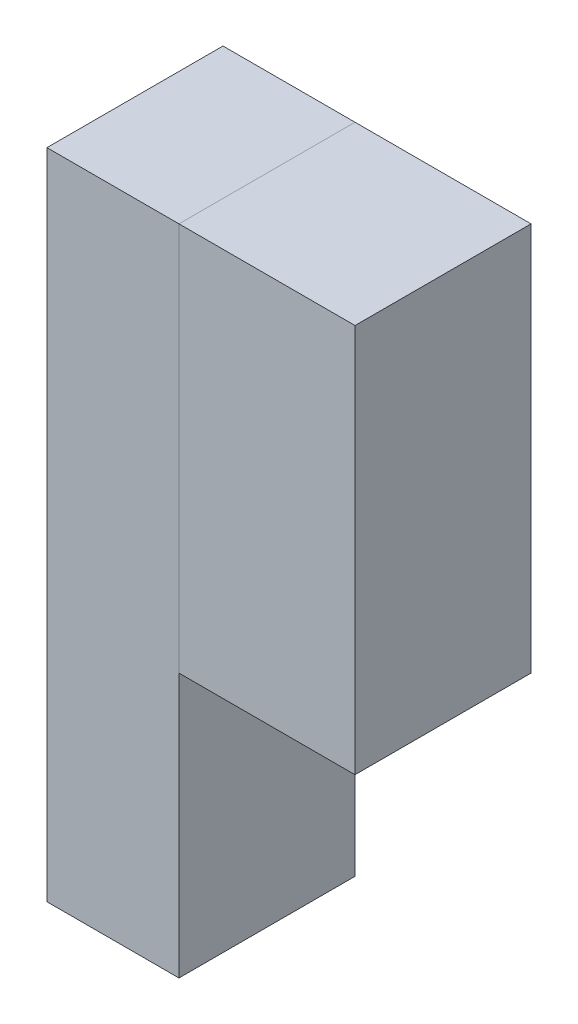
ISO-10303-21;
HEADER;
FILE_DESCRIPTION(('STEP AP214'),'2;1');
FILE_NAME('part.step','',(''),(''),'','','');
FILE_SCHEMA(('AUTOMOTIVE_DESIGN { 1 0 10303 214 1 1 1 1 }'));
ENDSEC;
DATA;
#1=APPLICATION_CONTEXT('core data for automotive mechanical design processes');
#2=APPLICATION_PROTOCOL_DEFINITION('international standard','automotive_design',2000,#1);
#3=PRODUCT_CONTEXT('',#1,'mechanical');
#4=PRODUCT('Part','Part','',(#3));
#5=PRODUCT_RELATED_PRODUCT_CATEGORY('part','',(#4));
#6=PRODUCT_DEFINITION_FORMATION('','',#4);
#7=PRODUCT_DEFINITION_CONTEXT('part definition',#1,'design');
#8=PRODUCT_DEFINITION('design','',#6,#7);
#9=PRODUCT_DEFINITION_SHAPE('','',#8);
#10=(LENGTH_UNIT() NAMED_UNIT(*) SI_UNIT(.MILLI.,.METRE.));
#11=(NAMED_UNIT(*) PLANE_ANGLE_UNIT() SI_UNIT($,.RADIAN.));
#12=(NAMED_UNIT(*) SI_UNIT($,.STERADIAN.) SOLID_ANGLE_UNIT());
#13=UNCERTAINTY_MEASURE_WITH_UNIT(LENGTH_MEASURE(1.E-05),#10,'distance_accuracy_value','');
#14=(GEOMETRIC_REPRESENTATION_CONTEXT(3) GLOBAL_UNCERTAINTY_ASSIGNED_CONTEXT((#13)) GLOBAL_UNIT_ASSIGNED_CONTEXT((#10,
#11,#12)) REPRESENTATION_CONTEXT('',''));
#15=CARTESIAN_POINT('',(0.,0.,0.));
#16=DIRECTION('',(0.,0.,1.));
#17=DIRECTION('',(1.,0.,0.));
#18=AXIS2_PLACEMENT_3D('',#15,#16,#17);
#19=CARTESIAN_POINT('',(1050.,2226.,0.));
#20=DIRECTION('',(0.,0.,-1.));
#21=DIRECTION('',(0.,1.,0.));
#22=AXIS2_PLACEMENT_3D('',#19,#20,#21);
#23=PLANE('',#22);
#24=DIRECTION('',(0.,-1.,0.));
#25=VECTOR('',#24,1.);
#26=CARTESIAN_POINT('',(450.,2226.,0.));
#27=LINE('',#26,#25);
#28=CARTESIAN_POINT('',(450.,2226.,0.));
#29=VERTEX_POINT('',#28);
#30=CARTESIAN_POINT('',(450.,900.,-1.62388165566939E-13));
#31=VERTEX_POINT('',#30);
#32=EDGE_CURVE('E114',#29,#31,#27,.T.);
#33=ORIENTED_EDGE('',*,*,#32,.T.);
#34=DIRECTION('',(-1.,0.,0.));
#35=VECTOR('',#34,1.);
#36=CARTESIAN_POINT('',(1050.,900.,-1.62388165566939E-13));
#37=LINE('',#36,#35);
#38=CARTESIAN_POINT('',(1050.,900.,-1.62388165566939E-13));
#39=VERTEX_POINT('',#38);
#40=EDGE_CURVE('E12',#39,#31,#37,.T.);
#41=ORIENTED_EDGE('',*,*,#40,.F.);
#42=DIRECTION('',(0.,-1.,0.));
#43=VECTOR('',#42,1.);
#44=CARTESIAN_POINT('',(1050.,2226.,0.));
#45=LINE('',#44,#43);
#46=CARTESIAN_POINT('',(1050.,2226.,0.));
#47=VERTEX_POINT('',#46);
#48=EDGE_CURVE('E102',#47,#39,#45,.T.);
#49=ORIENTED_EDGE('',*,*,#48,.F.);
#50=DIRECTION('',(-1.,0.,0.));
#51=VECTOR('',#50,1.);
#52=CARTESIAN_POINT('',(1050.,2226.,0.));
#53=LINE('',#52,#51);
#54=EDGE_CURVE('E110',#47,#29,#53,.T.);
#55=ORIENTED_EDGE('',*,*,#54,.T.);
#56=EDGE_LOOP('',(#33,#41,#49,#55));
#57=FACE_BOUND('',#56,.T.);
#58=ADVANCED_FACE('F51',(#57),#23,.F.);
#59=CARTESIAN_POINT('',(1050.,900.,-1.62388165566939E-13));
#60=DIRECTION('',(0.,1.,0.));
#61=DIRECTION('',(0.,0.,1.));
#62=AXIS2_PLACEMENT_3D('',#59,#60,#61);
#63=PLANE('',#62);
#64=DIRECTION('',(0.,0.,-1.));
#65=VECTOR('',#64,1.);
#66=CARTESIAN_POINT('',(450.,900.,-1.62388165566939E-13));
#67=LINE('',#66,#65);
#68=CARTESIAN_POINT('',(450.,900.,-600.));
#69=VERTEX_POINT('',#68);
#70=EDGE_CURVE('E106',#31,#69,#67,.T.);
#71=ORIENTED_EDGE('',*,*,#70,.T.);
#72=DIRECTION('',(-1.,0.,0.));
#73=VECTOR('',#72,1.);
#74=CARTESIAN_POINT('',(1050.,900.,-600.));
#75=LINE('',#74,#73);
#76=CARTESIAN_POINT('',(1050.,900.,-600.));
#77=VERTEX_POINT('',#76);
#78=EDGE_CURVE('E59',#77,#69,#75,.T.);
#79=ORIENTED_EDGE('',*,*,#78,.F.);
#80=DIRECTION('',(0.,0.,-1.));
#81=VECTOR('',#80,1.);
#82=CARTESIAN_POINT('',(1050.,900.,-1.62388165566939E-13));
#83=LINE('',#82,#81);
#84=EDGE_CURVE('E97',#39,#77,#83,.T.);
#85=ORIENTED_EDGE('',*,*,#84,.F.);
#86=ORIENTED_EDGE('',*,*,#40,.T.);
#87=EDGE_LOOP('',(#71,#79,#85,#86));
#88=FACE_BOUND('',#87,.T.);
#89=ADVANCED_FACE('F105',(#88),#63,.F.);
#90=CARTESIAN_POINT('',(1050.,2226.,-600.));
#91=DIRECTION('',(0.,0.,1.));
#92=DIRECTION('',(1.,0.,0.));
#93=AXIS2_PLACEMENT_3D('',#90,#91,#92);
#94=PLANE('',#93);
#95=DIRECTION('',(0.,1.,0.));
#96=VECTOR('',#95,1.);
#97=CARTESIAN_POINT('',(450.,2226.,-600.));
#98=LINE('',#97,#96);
#99=CARTESIAN_POINT('',(450.,2226.,-600.));
#100=VERTEX_POINT('',#99);
#101=EDGE_CURVE('E84',#69,#100,#98,.T.);
#102=ORIENTED_EDGE('',*,*,#101,.T.);
#103=DIRECTION('',(-1.,0.,0.));
#104=VECTOR('',#103,1.);
#105=CARTESIAN_POINT('',(1050.,2226.,-600.));
#106=LINE('',#105,#104);
#107=CARTESIAN_POINT('',(1050.,2226.,-600.));
#108=VERTEX_POINT('',#107);
#109=EDGE_CURVE('E107',#108,#100,#106,.T.);
#110=ORIENTED_EDGE('',*,*,#109,.F.);
#111=DIRECTION('',(0.,1.,0.));
#112=VECTOR('',#111,1.);
#113=CARTESIAN_POINT('',(1050.,2226.,-600.));
#114=LINE('',#113,#112);
#115=EDGE_CURVE('E100',#77,#108,#114,.T.);
#116=ORIENTED_EDGE('',*,*,#115,.F.);
#117=ORIENTED_EDGE('',*,*,#78,.T.);
#118=EDGE_LOOP('',(#102,#110,#116,#117));
#119=FACE_BOUND('',#118,.T.);
#120=ADVANCED_FACE('F108',(#119),#94,.F.);
#121=CARTESIAN_POINT('',(1050.,2226.,0.));
#122=DIRECTION('',(0.,-1.,0.));
#123=DIRECTION('',(0.,0.,-1.));
#124=AXIS2_PLACEMENT_3D('',#121,#122,#123);
#125=PLANE('',#124);
#126=DIRECTION('',(0.,0.,1.));
#127=VECTOR('',#126,1.);
#128=CARTESIAN_POINT('',(450.,2226.,0.));
#129=LINE('',#128,#127);
#130=EDGE_CURVE('E90',#100,#29,#129,.T.);
#131=ORIENTED_EDGE('',*,*,#130,.T.);
#132=ORIENTED_EDGE('',*,*,#54,.F.);
#133=DIRECTION('',(0.,0.,1.));
#134=VECTOR('',#133,1.);
#135=CARTESIAN_POINT('',(1050.,2226.,0.));
#136=LINE('',#135,#134);
#137=EDGE_CURVE('E67',#108,#47,#136,.T.);
#138=ORIENTED_EDGE('',*,*,#137,.F.);
#139=ORIENTED_EDGE('',*,*,#109,.T.);
#140=EDGE_LOOP('',(#131,#132,#138,#139));
#141=FACE_BOUND('',#140,.T.);
#142=ADVANCED_FACE('F121',(#141),#125,.F.);
#143=CARTESIAN_POINT('',(1050.,0.,0.));
#144=DIRECTION('',(1.,0.,0.));
#145=DIRECTION('',(0.,0.,-1.));
#146=AXIS2_PLACEMENT_3D('',#143,#144,#145);
#147=PLANE('',#146);
#148=ORIENTED_EDGE('',*,*,#48,.T.);
#149=ORIENTED_EDGE('',*,*,#84,.T.);
#150=ORIENTED_EDGE('',*,*,#115,.T.);
#151=ORIENTED_EDGE('',*,*,#137,.T.);
#152=EDGE_LOOP('',(#148,#149,#150,#151));
#153=FACE_BOUND('',#152,.T.);
#154=ADVANCED_FACE('F98',(#153),#147,.T.);
#155=CARTESIAN_POINT('',(450.,0.,0.));
#156=DIRECTION('',(1.,0.,0.));
#157=DIRECTION('',(0.,0.,-1.));
#158=AXIS2_PLACEMENT_3D('',#155,#156,#157);
#159=PLANE('',#158);
#160=ORIENTED_EDGE('',*,*,#32,.F.);
#161=ORIENTED_EDGE('',*,*,#130,.F.);
#162=ORIENTED_EDGE('',*,*,#101,.F.);
#163=ORIENTED_EDGE('',*,*,#70,.F.);
#164=EDGE_LOOP('',(#160,#161,#162,#163));
#165=FACE_BOUND('',#164,.T.);
#166=ADVANCED_FACE('F124',(#165),#159,.F.);
#167=CLOSED_SHELL('',(#58,#89,#120,#142,#154,#166));
#168=MANIFOLD_SOLID_BREP('B2',#167);
#169=CARTESIAN_POINT('',(0.,2226.,0.));
#170=DIRECTION('',(1.,0.,0.));
#171=DIRECTION('',(0.,0.,-1.));
#172=AXIS2_PLACEMENT_3D('',#169,#170,#171);
#173=PLANE('',#172);
#174=DIRECTION('',(0.,0.,1.));
#175=VECTOR('',#174,1.);
#176=CARTESIAN_POINT('',(0.,0.,0.));
#177=LINE('',#176,#175);
#178=CARTESIAN_POINT('',(0.,0.,-600.));
#179=VERTEX_POINT('',#178);
#180=CARTESIAN_POINT('',(0.,0.,0.));
#181=VERTEX_POINT('',#180);
#182=EDGE_CURVE('E245',#179,#181,#177,.T.);
#183=ORIENTED_EDGE('',*,*,#182,.T.);
#184=DIRECTION('',(0.,-1.,0.));
#185=VECTOR('',#184,1.);
#186=CARTESIAN_POINT('',(0.,2226.,0.));
#187=LINE('',#186,#185);
#188=CARTESIAN_POINT('',(0.,2226.,0.));
#189=VERTEX_POINT('',#188);
#190=EDGE_CURVE('E49',#189,#181,#187,.T.);
#191=ORIENTED_EDGE('',*,*,#190,.F.);
#192=DIRECTION('',(0.,0.,1.));
#193=VECTOR('',#192,1.);
#194=CARTESIAN_POINT('',(0.,2226.,0.));
#195=LINE('',#194,#193);
#196=CARTESIAN_POINT('',(0.,2226.,-600.));
#197=VERTEX_POINT('',#196);
#198=EDGE_CURVE('E229',#197,#189,#195,.T.);
#199=ORIENTED_EDGE('',*,*,#198,.F.);
#200=DIRECTION('',(0.,-1.,0.));
#201=VECTOR('',#200,1.);
#202=CARTESIAN_POINT('',(0.,2226.,-600.));
#203=LINE('',#202,#201);
#204=EDGE_CURVE('E241',#197,#179,#203,.T.);
#205=ORIENTED_EDGE('',*,*,#204,.T.);
#206=EDGE_LOOP('',(#183,#191,#199,#205));
#207=FACE_BOUND('',#206,.T.);
#208=ADVANCED_FACE('F177',(#207),#173,.F.);
#209=CARTESIAN_POINT('',(0.,2226.,0.));
#210=DIRECTION('',(0.,0.,-1.));
#211=DIRECTION('',(-1.,0.,0.));
#212=AXIS2_PLACEMENT_3D('',#209,#210,#211);
#213=PLANE('',#212);
#214=DIRECTION('',(1.,0.,0.));
#215=VECTOR('',#214,1.);
#216=CARTESIAN_POINT('',(0.,0.,0.));
#217=LINE('',#216,#215);
#218=CARTESIAN_POINT('',(450.,0.,0.));
#219=VERTEX_POINT('',#218);
#220=EDGE_CURVE('E234',#181,#219,#217,.T.);
#221=ORIENTED_EDGE('',*,*,#220,.T.);
#222=DIRECTION('',(0.,-1.,0.));
#223=VECTOR('',#222,1.);
#224=CARTESIAN_POINT('',(450.,2226.,0.));
#225=LINE('',#224,#223);
#226=CARTESIAN_POINT('',(450.,2226.,0.));
#227=VERTEX_POINT('',#226);
#228=EDGE_CURVE('E186',#227,#219,#225,.T.);
#229=ORIENTED_EDGE('',*,*,#228,.F.);
#230=DIRECTION('',(1.,0.,0.));
#231=VECTOR('',#230,1.);
#232=CARTESIAN_POINT('',(0.,2226.,0.));
#233=LINE('',#232,#231);
#234=EDGE_CURVE('E224',#189,#227,#233,.T.);
#235=ORIENTED_EDGE('',*,*,#234,.F.);
#236=ORIENTED_EDGE('',*,*,#190,.T.);
#237=EDGE_LOOP('',(#221,#229,#235,#236));
#238=FACE_BOUND('',#237,.T.);
#239=ADVANCED_FACE('F233',(#238),#213,.F.);
#240=CARTESIAN_POINT('',(450.,2226.,0.));
#241=DIRECTION('',(-1.,0.,0.));
#242=DIRECTION('',(0.,0.,1.));
#243=AXIS2_PLACEMENT_3D('',#240,#241,#242);
#244=PLANE('',#243);
#245=DIRECTION('',(0.,0.,-1.));
#246=VECTOR('',#245,1.);
#247=CARTESIAN_POINT('',(450.,0.,0.));
#248=LINE('',#247,#246);
#249=CARTESIAN_POINT('',(450.,0.,-600.));
#250=VERTEX_POINT('',#249);
#251=EDGE_CURVE('E211',#219,#250,#248,.T.);
#252=ORIENTED_EDGE('',*,*,#251,.T.);
#253=DIRECTION('',(0.,-1.,0.));
#254=VECTOR('',#253,1.);
#255=CARTESIAN_POINT('',(450.,2226.,-600.));
#256=LINE('',#255,#254);
#257=CARTESIAN_POINT('',(450.,2226.,-600.));
#258=VERTEX_POINT('',#257);
#259=EDGE_CURVE('E236',#258,#250,#256,.T.);
#260=ORIENTED_EDGE('',*,*,#259,.F.);
#261=DIRECTION('',(0.,0.,-1.));
#262=VECTOR('',#261,1.);
#263=CARTESIAN_POINT('',(450.,2226.,0.));
#264=LINE('',#263,#262);
#265=EDGE_CURVE('E227',#227,#258,#264,.T.);
#266=ORIENTED_EDGE('',*,*,#265,.F.);
#267=ORIENTED_EDGE('',*,*,#228,.T.);
#268=EDGE_LOOP('',(#252,#260,#266,#267));
#269=FACE_BOUND('',#268,.T.);
#270=ADVANCED_FACE('F237',(#269),#244,.F.);
#271=CARTESIAN_POINT('',(0.,2226.,-600.));
#272=DIRECTION('',(0.,0.,1.));
#273=DIRECTION('',(1.,0.,0.));
#274=AXIS2_PLACEMENT_3D('',#271,#272,#273);
#275=PLANE('',#274);
#276=DIRECTION('',(-1.,0.,0.));
#277=VECTOR('',#276,1.);
#278=CARTESIAN_POINT('',(0.,0.,-600.));
#279=LINE('',#278,#277);
#280=EDGE_CURVE('E217',#250,#179,#279,.T.);
#281=ORIENTED_EDGE('',*,*,#280,.T.);
#282=ORIENTED_EDGE('',*,*,#204,.F.);
#283=DIRECTION('',(-1.,0.,0.));
#284=VECTOR('',#283,1.);
#285=CARTESIAN_POINT('',(0.,2226.,-600.));
#286=LINE('',#285,#284);
#287=EDGE_CURVE('E194',#258,#197,#286,.T.);
#288=ORIENTED_EDGE('',*,*,#287,.F.);
#289=ORIENTED_EDGE('',*,*,#259,.T.);
#290=EDGE_LOOP('',(#281,#282,#288,#289));
#291=FACE_BOUND('',#290,.T.);
#292=ADVANCED_FACE('F258',(#291),#275,.F.);
#293=CARTESIAN_POINT('',(0.,2226.,0.));
#294=DIRECTION('',(0.,-1.,0.));
#295=DIRECTION('',(0.,0.,-1.));
#296=AXIS2_PLACEMENT_3D('',#293,#294,#295);
#297=PLANE('',#296);
#298=ORIENTED_EDGE('',*,*,#198,.T.);
#299=ORIENTED_EDGE('',*,*,#234,.T.);
#300=ORIENTED_EDGE('',*,*,#265,.T.);
#301=ORIENTED_EDGE('',*,*,#287,.T.);
#302=EDGE_LOOP('',(#298,#299,#300,#301));
#303=FACE_BOUND('',#302,.T.);
#304=ADVANCED_FACE('F225',(#303),#297,.F.);
#305=CARTESIAN_POINT('',(0.,0.,0.));
#306=DIRECTION('',(0.,-1.,0.));
#307=DIRECTION('',(0.,0.,-1.));
#308=AXIS2_PLACEMENT_3D('',#305,#306,#307);
#309=PLANE('',#308);
#310=ORIENTED_EDGE('',*,*,#182,.F.);
#311=ORIENTED_EDGE('',*,*,#280,.F.);
#312=ORIENTED_EDGE('',*,*,#251,.F.);
#313=ORIENTED_EDGE('',*,*,#220,.F.);
#314=EDGE_LOOP('',(#310,#311,#312,#313));
#315=FACE_BOUND('',#314,.T.);
#316=ADVANCED_FACE('F261',(#315),#309,.T.);
#317=CLOSED_SHELL('',(#208,#239,#270,#292,#304,#316));
#318=MANIFOLD_SOLID_BREP('B6',#317);
#319=ADVANCED_BREP_SHAPE_REPRESENTATION('',(#18,#168,#318),#14);
#320=SHAPE_DEFINITION_REPRESENTATION(#9,#319);
ENDSEC;
END-ISO-10303-21;
